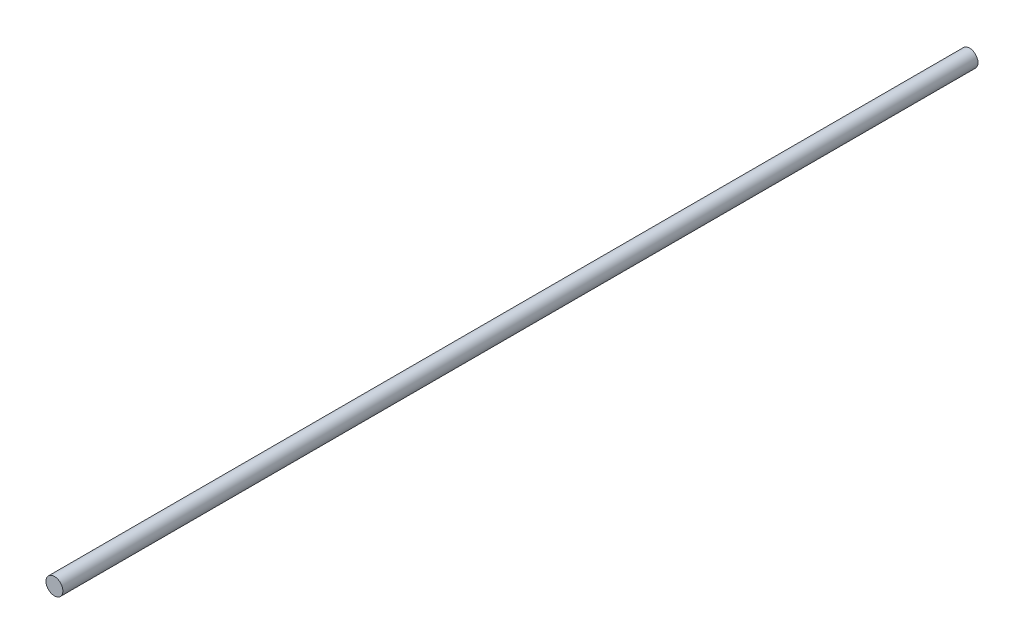
ISO-10303-21;
HEADER;
FILE_DESCRIPTION(('STEP AP214'),'2;1');
FILE_NAME('part.step','',(''),(''),'','','');
FILE_SCHEMA(('AUTOMOTIVE_DESIGN { 1 0 10303 214 1 1 1 1 }'));
ENDSEC;
DATA;
#1=APPLICATION_CONTEXT('core data for automotive mechanical design processes');
#2=APPLICATION_PROTOCOL_DEFINITION('international standard','automotive_design',2000,#1);
#3=PRODUCT_CONTEXT('',#1,'mechanical');
#4=PRODUCT('Part','Part','',(#3));
#5=PRODUCT_RELATED_PRODUCT_CATEGORY('part','',(#4));
#6=PRODUCT_DEFINITION_FORMATION('','',#4);
#7=PRODUCT_DEFINITION_CONTEXT('part definition',#1,'design');
#8=PRODUCT_DEFINITION('design','',#6,#7);
#9=PRODUCT_DEFINITION_SHAPE('','',#8);
#10=(LENGTH_UNIT() NAMED_UNIT(*) SI_UNIT(.MILLI.,.METRE.));
#11=(NAMED_UNIT(*) PLANE_ANGLE_UNIT() SI_UNIT($,.RADIAN.));
#12=(NAMED_UNIT(*) SI_UNIT($,.STERADIAN.) SOLID_ANGLE_UNIT());
#13=UNCERTAINTY_MEASURE_WITH_UNIT(LENGTH_MEASURE(1.E-05),#10,'distance_accuracy_value','');
#14=(GEOMETRIC_REPRESENTATION_CONTEXT(3) GLOBAL_UNCERTAINTY_ASSIGNED_CONTEXT((#13)) GLOBAL_UNIT_ASSIGNED_CONTEXT((#10,
#11,#12)) REPRESENTATION_CONTEXT('',''));
#15=CARTESIAN_POINT('',(0.,0.,0.));
#16=DIRECTION('',(0.,0.,1.));
#17=DIRECTION('',(1.,0.,0.));
#18=AXIS2_PLACEMENT_3D('',#15,#16,#17);
#19=CARTESIAN_POINT('',(0.,0.,260.));
#20=DIRECTION('',(0.,0.,-1.));
#21=DIRECTION('',(-1.,0.,0.));
#22=AXIS2_PLACEMENT_3D('',#19,#20,#21);
#23=CYLINDRICAL_SURFACE('',#22,2.4);
#24=CARTESIAN_POINT('',(0.,0.,260.));
#25=DIRECTION('',(0.,0.,1.));
#26=DIRECTION('',(1.,0.,0.));
#27=AXIS2_PLACEMENT_3D('',#24,#25,#26);
#28=CIRCLE('',#27,2.4);
#29=CARTESIAN_POINT('',(2.4,0.,260.));
#30=VERTEX_POINT('',#29);
#31=EDGE_CURVE('E10',#30,#30,#28,.T.);
#32=ORIENTED_EDGE('',*,*,#31,.F.);
#33=EDGE_LOOP('',(#32));
#34=FACE_BOUND('',#33,.T.);
#35=CARTESIAN_POINT('',(0.,0.,0.));
#36=DIRECTION('',(0.,0.,1.));
#37=DIRECTION('',(1.,0.,0.));
#38=AXIS2_PLACEMENT_3D('',#35,#36,#37);
#39=CIRCLE('',#38,2.4);
#40=CARTESIAN_POINT('',(2.4,0.,0.));
#41=VERTEX_POINT('',#40);
#42=EDGE_CURVE('E33',#41,#41,#39,.T.);
#43=ORIENTED_EDGE('',*,*,#42,.T.);
#44=EDGE_LOOP('',(#43));
#45=FACE_BOUND('',#44,.T.);
#46=ADVANCED_FACE('F30',(#34,#45),#23,.T.);
#47=CARTESIAN_POINT('',(0.,0.,260.));
#48=DIRECTION('',(0.,0.,1.));
#49=DIRECTION('',(1.,0.,0.));
#50=AXIS2_PLACEMENT_3D('',#47,#48,#49);
#51=PLANE('',#50);
#52=ORIENTED_EDGE('',*,*,#31,.T.);
#53=EDGE_LOOP('',(#52));
#54=FACE_BOUND('',#53,.T.);
#55=ADVANCED_FACE('F45',(#54),#51,.T.);
#56=CARTESIAN_POINT('',(0.,0.,0.));
#57=DIRECTION('',(0.,0.,1.));
#58=DIRECTION('',(1.,0.,0.));
#59=AXIS2_PLACEMENT_3D('',#56,#57,#58);
#60=PLANE('',#59);
#61=ORIENTED_EDGE('',*,*,#42,.F.);
#62=EDGE_LOOP('',(#61));
#63=FACE_BOUND('',#62,.T.);
#64=ADVANCED_FACE('F43',(#63),#60,.F.);
#65=CLOSED_SHELL('',(#46,#55,#64));
#66=MANIFOLD_SOLID_BREP('B2',#65);
#67=ADVANCED_BREP_SHAPE_REPRESENTATION('',(#18,#66),#14);
#68=SHAPE_DEFINITION_REPRESENTATION(#9,#67);
ENDSEC;
END-ISO-10303-21;
